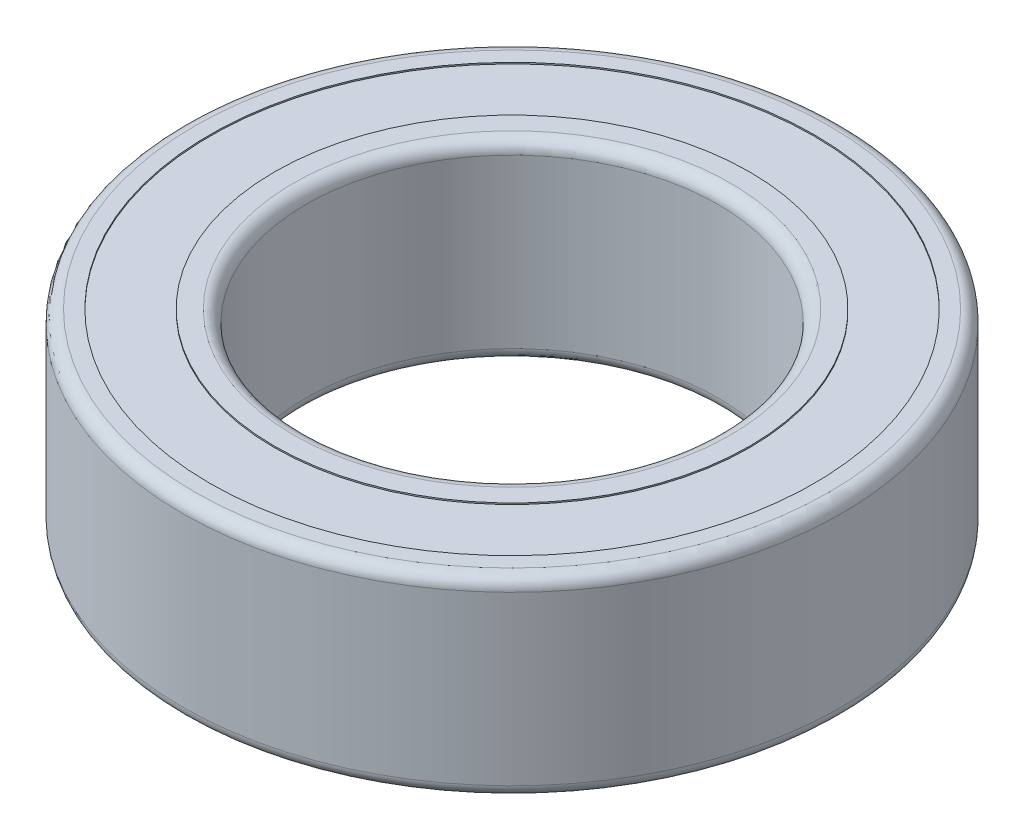
ISO-10303-21;
HEADER;
FILE_DESCRIPTION(('STEP AP214'),'2;1');
FILE_NAME('part.step','',(''),(''),'','','');
FILE_SCHEMA(('AUTOMOTIVE_DESIGN { 1 0 10303 214 1 1 1 1 }'));
ENDSEC;
DATA;
#1=APPLICATION_CONTEXT('core data for automotive mechanical design processes');
#2=APPLICATION_PROTOCOL_DEFINITION('international standard','automotive_design',2000,#1);
#3=PRODUCT_CONTEXT('',#1,'mechanical');
#4=PRODUCT('Part','Part','',(#3));
#5=PRODUCT_RELATED_PRODUCT_CATEGORY('part','',(#4));
#6=PRODUCT_DEFINITION_FORMATION('','',#4);
#7=PRODUCT_DEFINITION_CONTEXT('part definition',#1,'design');
#8=PRODUCT_DEFINITION('design','',#6,#7);
#9=PRODUCT_DEFINITION_SHAPE('','',#8);
#10=(LENGTH_UNIT() NAMED_UNIT(*) SI_UNIT(.MILLI.,.METRE.));
#11=(NAMED_UNIT(*) PLANE_ANGLE_UNIT() SI_UNIT($,.RADIAN.));
#12=(NAMED_UNIT(*) SI_UNIT($,.STERADIAN.) SOLID_ANGLE_UNIT());
#13=UNCERTAINTY_MEASURE_WITH_UNIT(LENGTH_MEASURE(1.E-05),#10,'distance_accuracy_value','');
#14=(GEOMETRIC_REPRESENTATION_CONTEXT(3) GLOBAL_UNCERTAINTY_ASSIGNED_CONTEXT((#13)) GLOBAL_UNIT_ASSIGNED_CONTEXT((#10,
#11,#12)) REPRESENTATION_CONTEXT('',''));
#15=CARTESIAN_POINT('',(0.,0.,0.));
#16=DIRECTION('',(0.,0.,1.));
#17=DIRECTION('',(1.,0.,0.));
#18=AXIS2_PLACEMENT_3D('',#15,#16,#17);
#19=CARTESIAN_POINT('',(0.,-3.5,0.));
#20=DIRECTION('',(0.,1.,0.));
#21=DIRECTION('',(0.,0.,1.));
#22=AXIS2_PLACEMENT_3D('',#19,#20,#21);
#23=PLANE('',#22);
#24=CARTESIAN_POINT('',(0.,-3.5,0.));
#25=DIRECTION('',(0.,1.,0.));
#26=DIRECTION('',(0.,0.,1.));
#27=AXIS2_PLACEMENT_3D('',#24,#25,#26);
#28=CIRCLE('',#27,7.95);
#29=CARTESIAN_POINT('',(0.,-3.5,7.95));
#30=VERTEX_POINT('',#29);
#31=EDGE_CURVE('E72',#30,#30,#28,.T.);
#32=ORIENTED_EDGE('',*,*,#31,.T.);
#33=EDGE_LOOP('',(#32));
#34=FACE_BOUND('',#33,.T.);
#35=CARTESIAN_POINT('',(0.,-3.5,0.));
#36=DIRECTION('',(0.,1.,0.));
#37=DIRECTION('',(0.,0.,1.));
#38=AXIS2_PLACEMENT_3D('',#35,#36,#37);
#39=CIRCLE('',#38,8.65);
#40=CARTESIAN_POINT('',(0.,-3.5,8.65));
#41=VERTEX_POINT('',#40);
#42=EDGE_CURVE('E94',#41,#41,#39,.T.);
#43=ORIENTED_EDGE('',*,*,#42,.F.);
#44=EDGE_LOOP('',(#43));
#45=FACE_BOUND('',#44,.T.);
#46=ADVANCED_FACE('F43',(#34,#45),#23,.F.);
#47=CARTESIAN_POINT('',(0.,3.5,0.));
#48=DIRECTION('',(0.,1.,0.));
#49=DIRECTION('',(0.,0.,1.));
#50=AXIS2_PLACEMENT_3D('',#47,#48,#49);
#51=PLANE('',#50);
#52=CARTESIAN_POINT('',(0.,3.5,0.));
#53=DIRECTION('',(0.,1.,0.));
#54=DIRECTION('',(0.,0.,1.));
#55=AXIS2_PLACEMENT_3D('',#52,#53,#54);
#56=CIRCLE('',#55,7.95);
#57=CARTESIAN_POINT('',(0.,3.5,7.95));
#58=VERTEX_POINT('',#57);
#59=EDGE_CURVE('E63',#58,#58,#56,.F.);
#60=ORIENTED_EDGE('',*,*,#59,.T.);
#61=EDGE_LOOP('',(#60));
#62=FACE_BOUND('',#61,.T.);
#63=CARTESIAN_POINT('',(0.,3.5,0.));
#64=DIRECTION('',(0.,1.,0.));
#65=DIRECTION('',(0.,0.,1.));
#66=AXIS2_PLACEMENT_3D('',#63,#64,#65);
#67=CIRCLE('',#66,8.65);
#68=CARTESIAN_POINT('',(0.,3.5,8.65));
#69=VERTEX_POINT('',#68);
#70=EDGE_CURVE('E82',#69,#69,#67,.T.);
#71=ORIENTED_EDGE('',*,*,#70,.T.);
#72=EDGE_LOOP('',(#71));
#73=FACE_BOUND('',#72,.T.);
#74=ADVANCED_FACE('F111',(#62,#73),#51,.T.);
#75=CARTESIAN_POINT('',(0.,3.5,0.));
#76=DIRECTION('',(0.,1.,0.));
#77=DIRECTION('',(0.,0.,1.));
#78=AXIS2_PLACEMENT_3D('',#75,#76,#77);
#79=CIRCLE('',#78,11.55);
#80=CARTESIAN_POINT('',(0.,3.5,11.55));
#81=VERTEX_POINT('',#80);
#82=EDGE_CURVE('E10',#81,#81,#79,.T.);
#83=ORIENTED_EDGE('',*,*,#82,.T.);
#84=EDGE_LOOP('',(#83));
#85=FACE_BOUND('',#84,.T.);
#86=CARTESIAN_POINT('',(0.,3.5,0.));
#87=DIRECTION('',(0.,1.,0.));
#88=DIRECTION('',(0.,0.,1.));
#89=AXIS2_PLACEMENT_3D('',#86,#87,#88);
#90=CIRCLE('',#89,11.);
#91=CARTESIAN_POINT('',(0.,3.5,11.));
#92=VERTEX_POINT('',#91);
#93=EDGE_CURVE('E76',#92,#92,#90,.T.);
#94=ORIENTED_EDGE('',*,*,#93,.F.);
#95=EDGE_LOOP('',(#94));
#96=FACE_BOUND('',#95,.T.);
#97=ADVANCED_FACE('F118',(#85,#96),#51,.T.);
#98=CARTESIAN_POINT('',(0.,-3.5,0.));
#99=DIRECTION('',(0.,1.,0.));
#100=DIRECTION('',(0.,0.,1.));
#101=AXIS2_PLACEMENT_3D('',#98,#99,#100);
#102=CIRCLE('',#101,11.55);
#103=CARTESIAN_POINT('',(0.,-3.5,11.55));
#104=VERTEX_POINT('',#103);
#105=EDGE_CURVE('E50',#104,#104,#102,.F.);
#106=ORIENTED_EDGE('',*,*,#105,.T.);
#107=EDGE_LOOP('',(#106));
#108=FACE_BOUND('',#107,.T.);
#109=CARTESIAN_POINT('',(0.,-3.5,0.));
#110=DIRECTION('',(0.,1.,0.));
#111=DIRECTION('',(0.,0.,1.));
#112=AXIS2_PLACEMENT_3D('',#109,#110,#111);
#113=CIRCLE('',#112,11.);
#114=CARTESIAN_POINT('',(0.,-3.5,11.));
#115=VERTEX_POINT('',#114);
#116=EDGE_CURVE('E88',#115,#115,#113,.T.);
#117=ORIENTED_EDGE('',*,*,#116,.T.);
#118=EDGE_LOOP('',(#117));
#119=FACE_BOUND('',#118,.T.);
#120=ADVANCED_FACE('F114',(#108,#119),#23,.F.);
#121=CARTESIAN_POINT('',(0.,3.5,0.));
#122=DIRECTION('',(0.,-1.,0.));
#123=DIRECTION('',(0.,0.,-1.));
#124=AXIS2_PLACEMENT_3D('',#121,#122,#123);
#125=CYLINDRICAL_SURFACE('',#124,12.);
#126=CARTESIAN_POINT('',(0.,-3.05,0.));
#127=DIRECTION('',(0.,1.,0.));
#128=DIRECTION('',(0.,0.,1.));
#129=AXIS2_PLACEMENT_3D('',#126,#127,#128);
#130=CIRCLE('',#129,12.);
#131=CARTESIAN_POINT('',(0.,-3.05,12.));
#132=VERTEX_POINT('',#131);
#133=EDGE_CURVE('E54',#132,#132,#130,.T.);
#134=ORIENTED_EDGE('',*,*,#133,.T.);
#135=EDGE_LOOP('',(#134));
#136=FACE_BOUND('',#135,.T.);
#137=CARTESIAN_POINT('',(0.,3.05,0.));
#138=DIRECTION('',(0.,1.,0.));
#139=DIRECTION('',(0.,0.,1.));
#140=AXIS2_PLACEMENT_3D('',#137,#138,#139);
#141=CIRCLE('',#140,12.);
#142=CARTESIAN_POINT('',(0.,3.05,12.));
#143=VERTEX_POINT('',#142);
#144=EDGE_CURVE('E58',#143,#143,#141,.F.);
#145=ORIENTED_EDGE('',*,*,#144,.T.);
#146=EDGE_LOOP('',(#145));
#147=FACE_BOUND('',#146,.T.);
#148=ADVANCED_FACE('F123',(#136,#147),#125,.T.);
#149=CARTESIAN_POINT('',(0.,3.5,0.));
#150=DIRECTION('',(0.,-1.,0.));
#151=DIRECTION('',(0.,0.,-1.));
#152=AXIS2_PLACEMENT_3D('',#149,#150,#151);
#153=CYLINDRICAL_SURFACE('',#152,7.5);
#154=CARTESIAN_POINT('',(0.,-3.05,0.));
#155=DIRECTION('',(0.,1.,0.));
#156=DIRECTION('',(0.,0.,1.));
#157=AXIS2_PLACEMENT_3D('',#154,#155,#156);
#158=CIRCLE('',#157,7.5);
#159=CARTESIAN_POINT('',(0.,-3.05,7.5));
#160=VERTEX_POINT('',#159);
#161=EDGE_CURVE('E66',#160,#160,#158,.F.);
#162=ORIENTED_EDGE('',*,*,#161,.T.);
#163=EDGE_LOOP('',(#162));
#164=FACE_BOUND('',#163,.T.);
#165=CARTESIAN_POINT('',(0.,3.05,0.));
#166=DIRECTION('',(0.,1.,0.));
#167=DIRECTION('',(0.,0.,1.));
#168=AXIS2_PLACEMENT_3D('',#165,#166,#167);
#169=CIRCLE('',#168,7.5);
#170=CARTESIAN_POINT('',(0.,3.05,7.5));
#171=VERTEX_POINT('',#170);
#172=EDGE_CURVE('E69',#171,#171,#169,.T.);
#173=ORIENTED_EDGE('',*,*,#172,.T.);
#174=EDGE_LOOP('',(#173));
#175=FACE_BOUND('',#174,.T.);
#176=ADVANCED_FACE('F128',(#164,#175),#153,.F.);
#177=CARTESIAN_POINT('',(0.,3.45,0.));
#178=DIRECTION('',(0.,1.,0.));
#179=DIRECTION('',(0.,0.,1.));
#180=AXIS2_PLACEMENT_3D('',#177,#178,#179);
#181=CYLINDRICAL_SURFACE('',#180,11.);
#182=CARTESIAN_POINT('',(0.,3.45,0.));
#183=DIRECTION('',(0.,1.,0.));
#184=DIRECTION('',(0.,0.,1.));
#185=AXIS2_PLACEMENT_3D('',#182,#183,#184);
#186=CIRCLE('',#185,11.);
#187=CARTESIAN_POINT('',(0.,3.45,11.));
#188=VERTEX_POINT('',#187);
#189=EDGE_CURVE('E75',#188,#188,#186,.T.);
#190=ORIENTED_EDGE('',*,*,#189,.F.);
#191=EDGE_LOOP('',(#190));
#192=FACE_BOUND('',#191,.T.);
#193=ORIENTED_EDGE('',*,*,#93,.T.);
#194=EDGE_LOOP('',(#193));
#195=FACE_BOUND('',#194,.T.);
#196=ADVANCED_FACE('F150',(#192,#195),#181,.F.);
#197=CARTESIAN_POINT('',(0.,3.45,0.));
#198=DIRECTION('',(0.,1.,0.));
#199=DIRECTION('',(0.,0.,1.));
#200=AXIS2_PLACEMENT_3D('',#197,#198,#199);
#201=PLANE('',#200);
#202=CARTESIAN_POINT('',(0.,3.45,0.));
#203=DIRECTION('',(0.,1.,0.));
#204=DIRECTION('',(0.,0.,1.));
#205=AXIS2_PLACEMENT_3D('',#202,#203,#204);
#206=CIRCLE('',#205,8.65);
#207=CARTESIAN_POINT('',(0.,3.45,8.65));
#208=VERTEX_POINT('',#207);
#209=EDGE_CURVE('E79',#208,#208,#206,.T.);
#210=ORIENTED_EDGE('',*,*,#209,.F.);
#211=EDGE_LOOP('',(#210));
#212=FACE_BOUND('',#211,.T.);
#213=ORIENTED_EDGE('',*,*,#189,.T.);
#214=EDGE_LOOP('',(#213));
#215=FACE_BOUND('',#214,.T.);
#216=ADVANCED_FACE('F146',(#212,#215),#201,.T.);
#217=CARTESIAN_POINT('',(0.,3.45,0.));
#218=DIRECTION('',(0.,1.,0.));
#219=DIRECTION('',(0.,0.,1.));
#220=AXIS2_PLACEMENT_3D('',#217,#218,#219);
#221=CYLINDRICAL_SURFACE('',#220,8.65);
#222=ORIENTED_EDGE('',*,*,#209,.T.);
#223=EDGE_LOOP('',(#222));
#224=FACE_BOUND('',#223,.T.);
#225=ORIENTED_EDGE('',*,*,#70,.F.);
#226=EDGE_LOOP('',(#225));
#227=FACE_BOUND('',#226,.T.);
#228=ADVANCED_FACE('F140',(#224,#227),#221,.T.);
#229=CARTESIAN_POINT('',(0.,-3.45,0.));
#230=DIRECTION('',(0.,-1.,0.));
#231=DIRECTION('',(0.,0.,1.));
#232=AXIS2_PLACEMENT_3D('',#229,#230,#231);
#233=PLANE('',#232);
#234=CARTESIAN_POINT('',(0.,-3.45,0.));
#235=DIRECTION('',(0.,1.,0.));
#236=DIRECTION('',(0.,0.,1.));
#237=AXIS2_PLACEMENT_3D('',#234,#235,#236);
#238=CIRCLE('',#237,11.);
#239=CARTESIAN_POINT('',(0.,-3.45,11.));
#240=VERTEX_POINT('',#239);
#241=EDGE_CURVE('E85',#240,#240,#238,.T.);
#242=ORIENTED_EDGE('',*,*,#241,.F.);
#243=EDGE_LOOP('',(#242));
#244=FACE_BOUND('',#243,.T.);
#245=CARTESIAN_POINT('',(0.,-3.45,0.));
#246=DIRECTION('',(0.,1.,0.));
#247=DIRECTION('',(0.,0.,1.));
#248=AXIS2_PLACEMENT_3D('',#245,#246,#247);
#249=CIRCLE('',#248,8.65);
#250=CARTESIAN_POINT('',(0.,-3.45,8.65));
#251=VERTEX_POINT('',#250);
#252=EDGE_CURVE('E91',#251,#251,#249,.T.);
#253=ORIENTED_EDGE('',*,*,#252,.T.);
#254=EDGE_LOOP('',(#253));
#255=FACE_BOUND('',#254,.T.);
#256=ADVANCED_FACE('F100',(#244,#255),#233,.T.);
#257=CARTESIAN_POINT('',(0.,-3.45,0.));
#258=DIRECTION('',(0.,-1.,0.));
#259=DIRECTION('',(0.,0.,-1.));
#260=AXIS2_PLACEMENT_3D('',#257,#258,#259);
#261=CYLINDRICAL_SURFACE('',#260,11.);
#262=ORIENTED_EDGE('',*,*,#241,.T.);
#263=EDGE_LOOP('',(#262));
#264=FACE_BOUND('',#263,.T.);
#265=ORIENTED_EDGE('',*,*,#116,.F.);
#266=EDGE_LOOP('',(#265));
#267=FACE_BOUND('',#266,.T.);
#268=ADVANCED_FACE('F106',(#264,#267),#261,.F.);
#269=CARTESIAN_POINT('',(0.,-3.45,0.));
#270=DIRECTION('',(0.,-1.,0.));
#271=DIRECTION('',(0.,0.,-1.));
#272=AXIS2_PLACEMENT_3D('',#269,#270,#271);
#273=CYLINDRICAL_SURFACE('',#272,8.65);
#274=ORIENTED_EDGE('',*,*,#252,.F.);
#275=EDGE_LOOP('',(#274));
#276=FACE_BOUND('',#275,.T.);
#277=ORIENTED_EDGE('',*,*,#42,.T.);
#278=EDGE_LOOP('',(#277));
#279=FACE_BOUND('',#278,.T.);
#280=ADVANCED_FACE('F102',(#276,#279),#273,.T.);
#281=CARTESIAN_POINT('',(0.,-3.05,0.));
#282=DIRECTION('',(0.,1.,0.));
#283=DIRECTION('',(0.,0.,1.));
#284=AXIS2_PLACEMENT_3D('',#281,#282,#283);
#285=TOROIDAL_SURFACE('',#284,7.95,0.45);
#286=ORIENTED_EDGE('',*,*,#161,.F.);
#287=EDGE_LOOP('',(#286));
#288=FACE_BOUND('',#287,.T.);
#289=ORIENTED_EDGE('',*,*,#31,.F.);
#290=EDGE_LOOP('',(#289));
#291=FACE_BOUND('',#290,.T.);
#292=ADVANCED_FACE('F105',(#288,#291),#285,.T.);
#293=CARTESIAN_POINT('',(0.,3.05,0.));
#294=DIRECTION('',(0.,1.,0.));
#295=DIRECTION('',(0.,0.,1.));
#296=AXIS2_PLACEMENT_3D('',#293,#294,#295);
#297=TOROIDAL_SURFACE('',#296,7.95,0.45);
#298=ORIENTED_EDGE('',*,*,#59,.F.);
#299=EDGE_LOOP('',(#298));
#300=FACE_BOUND('',#299,.T.);
#301=ORIENTED_EDGE('',*,*,#172,.F.);
#302=EDGE_LOOP('',(#301));
#303=FACE_BOUND('',#302,.T.);
#304=ADVANCED_FACE('F164',(#300,#303),#297,.T.);
#305=CARTESIAN_POINT('',(0.,-3.05,0.));
#306=DIRECTION('',(0.,1.,0.));
#307=DIRECTION('',(0.,0.,1.));
#308=AXIS2_PLACEMENT_3D('',#305,#306,#307);
#309=TOROIDAL_SURFACE('',#308,11.55,0.45);
#310=ORIENTED_EDGE('',*,*,#105,.F.);
#311=EDGE_LOOP('',(#310));
#312=FACE_BOUND('',#311,.T.);
#313=ORIENTED_EDGE('',*,*,#133,.F.);
#314=EDGE_LOOP('',(#313));
#315=FACE_BOUND('',#314,.T.);
#316=ADVANCED_FACE('F166',(#312,#315),#309,.T.);
#317=CARTESIAN_POINT('',(0.,3.05,0.));
#318=DIRECTION('',(0.,1.,0.));
#319=DIRECTION('',(0.,0.,1.));
#320=AXIS2_PLACEMENT_3D('',#317,#318,#319);
#321=TOROIDAL_SURFACE('',#320,11.55,0.45);
#322=ORIENTED_EDGE('',*,*,#144,.F.);
#323=EDGE_LOOP('',(#322));
#324=FACE_BOUND('',#323,.T.);
#325=ORIENTED_EDGE('',*,*,#82,.F.);
#326=EDGE_LOOP('',(#325));
#327=FACE_BOUND('',#326,.T.);
#328=ADVANCED_FACE('F45',(#324,#327),#321,.T.);
#329=CLOSED_SHELL('',(#46,#74,#97,#120,#148,#176,#196,#216,#228,#256,#268,#280,#292,#304,#316,#328));
#330=MANIFOLD_SOLID_BREP('B2',#329);
#331=ADVANCED_BREP_SHAPE_REPRESENTATION('',(#18,#330),#14);
#332=SHAPE_DEFINITION_REPRESENTATION(#9,#331);
ENDSEC;
END-ISO-10303-21;
